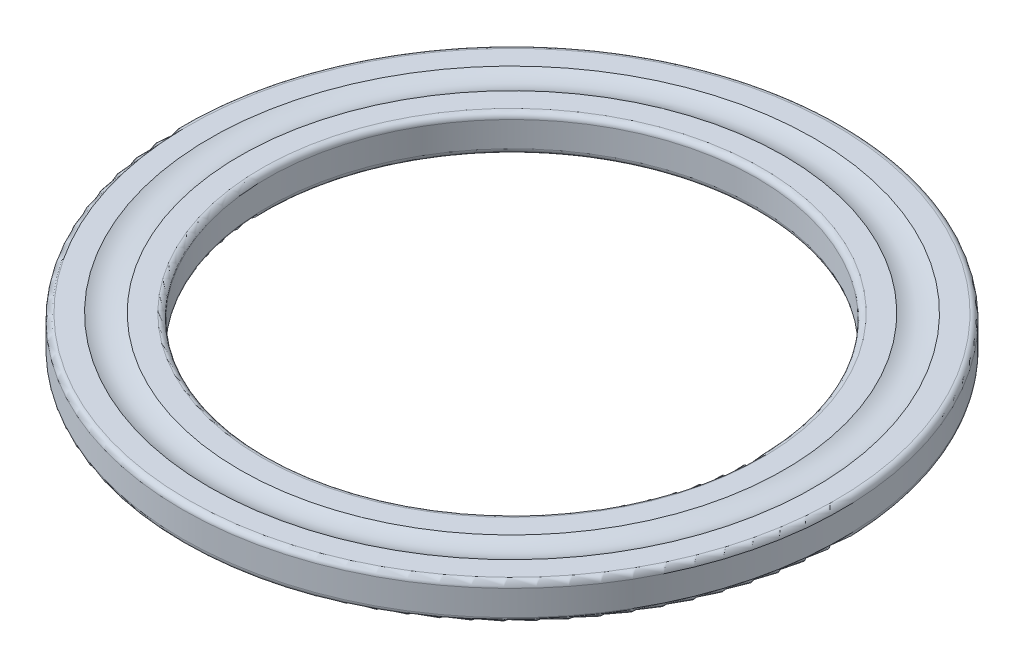
ISO-10303-21;
HEADER;
FILE_DESCRIPTION(('STEP AP214'),'2;1');
FILE_NAME('part.step','',(''),(''),'','','');
FILE_SCHEMA(('AUTOMOTIVE_DESIGN { 1 0 10303 214 1 1 1 1 }'));
ENDSEC;
DATA;
#1=APPLICATION_CONTEXT('core data for automotive mechanical design processes');
#2=APPLICATION_PROTOCOL_DEFINITION('international standard','automotive_design',2000,#1);
#3=PRODUCT_CONTEXT('',#1,'mechanical');
#4=PRODUCT('Part','Part','',(#3));
#5=PRODUCT_RELATED_PRODUCT_CATEGORY('part','',(#4));
#6=PRODUCT_DEFINITION_FORMATION('','',#4);
#7=PRODUCT_DEFINITION_CONTEXT('part definition',#1,'design');
#8=PRODUCT_DEFINITION('design','',#6,#7);
#9=PRODUCT_DEFINITION_SHAPE('','',#8);
#10=(LENGTH_UNIT() NAMED_UNIT(*) SI_UNIT(.MILLI.,.METRE.));
#11=(NAMED_UNIT(*) PLANE_ANGLE_UNIT() SI_UNIT($,.RADIAN.));
#12=(NAMED_UNIT(*) SI_UNIT($,.STERADIAN.) SOLID_ANGLE_UNIT());
#13=UNCERTAINTY_MEASURE_WITH_UNIT(LENGTH_MEASURE(1.E-05),#10,'distance_accuracy_value','');
#14=(GEOMETRIC_REPRESENTATION_CONTEXT(3) GLOBAL_UNCERTAINTY_ASSIGNED_CONTEXT((#13)) GLOBAL_UNIT_ASSIGNED_CONTEXT((#10,
#11,#12)) REPRESENTATION_CONTEXT('',''));
#15=CARTESIAN_POINT('',(0.,0.,0.));
#16=DIRECTION('',(0.,0.,1.));
#17=DIRECTION('',(1.,0.,0.));
#18=AXIS2_PLACEMENT_3D('',#15,#16,#17);
#19=CARTESIAN_POINT('',(-34.4,0.,0.));
#20=DIRECTION('',(0.,-1.,0.));
#21=DIRECTION('',(0.,0.,-1.));
#22=AXIS2_PLACEMENT_3D('',#19,#20,#21);
#23=PLANE('',#22);
#24=CARTESIAN_POINT('',(0.,0.,0.));
#25=DIRECTION('',(0.,1.,0.));
#26=DIRECTION('',(0.,0.,1.));
#27=AXIS2_PLACEMENT_3D('',#24,#25,#26);
#28=CIRCLE('',#27,26.6);
#29=CARTESIAN_POINT('',(0.,0.,26.6));
#30=VERTEX_POINT('',#29);
#31=EDGE_CURVE('E56',#30,#30,#28,.T.);
#32=ORIENTED_EDGE('',*,*,#31,.T.);
#33=EDGE_LOOP('',(#32));
#34=FACE_BOUND('',#33,.T.);
#35=CARTESIAN_POINT('',(0.,0.,0.));
#36=DIRECTION('',(0.,1.,0.));
#37=DIRECTION('',(0.,0.,1.));
#38=AXIS2_PLACEMENT_3D('',#35,#36,#37);
#39=CIRCLE('',#38,34.4);
#40=CARTESIAN_POINT('',(0.,0.,34.4));
#41=VERTEX_POINT('',#40);
#42=EDGE_CURVE('E54',#41,#41,#39,.T.);
#43=ORIENTED_EDGE('',*,*,#42,.F.);
#44=EDGE_LOOP('',(#43));
#45=FACE_BOUND('',#44,.T.);
#46=ADVANCED_FACE('F14',(#34,#45),#23,.T.);
#47=CARTESIAN_POINT('',(0.,0.599999999999872,0.));
#48=DIRECTION('',(0.,1.,0.));
#49=DIRECTION('',(0.,0.,1.));
#50=AXIS2_PLACEMENT_3D('',#47,#48,#49);
#51=TOROIDAL_SURFACE('',#50,26.6,0.599999999999872);
#52=CARTESIAN_POINT('',(0.,0.6,0.));
#53=DIRECTION('',(0.,1.,0.));
#54=DIRECTION('',(0.,0.,1.));
#55=AXIS2_PLACEMENT_3D('',#52,#53,#54);
#56=CIRCLE('',#55,26.);
#57=CARTESIAN_POINT('',(0.,0.6,26.));
#58=VERTEX_POINT('',#57);
#59=EDGE_CURVE('E51',#58,#58,#56,.T.);
#60=ORIENTED_EDGE('',*,*,#59,.T.);
#61=EDGE_LOOP('',(#60));
#62=FACE_BOUND('',#61,.T.);
#63=ORIENTED_EDGE('',*,*,#31,.F.);
#64=EDGE_LOOP('',(#63));
#65=FACE_BOUND('',#64,.T.);
#66=ADVANCED_FACE('F68',(#62,#65),#51,.T.);
#67=CARTESIAN_POINT('',(0.,3.8888888888889,0.));
#68=DIRECTION('',(0.,1.,0.));
#69=DIRECTION('',(0.,0.,1.));
#70=AXIS2_PLACEMENT_3D('',#67,#68,#69);
#71=CYLINDRICAL_SURFACE('',#70,26.);
#72=CARTESIAN_POINT('',(0.,3.2888888888889,0.));
#73=DIRECTION('',(0.,1.,0.));
#74=DIRECTION('',(0.,0.,1.));
#75=AXIS2_PLACEMENT_3D('',#72,#73,#74);
#76=CIRCLE('',#75,26.);
#77=CARTESIAN_POINT('',(0.,3.2888888888889,26.));
#78=VERTEX_POINT('',#77);
#79=EDGE_CURVE('E50',#78,#78,#76,.T.);
#80=ORIENTED_EDGE('',*,*,#79,.T.);
#81=EDGE_LOOP('',(#80));
#82=FACE_BOUND('',#81,.T.);
#83=ORIENTED_EDGE('',*,*,#59,.F.);
#84=EDGE_LOOP('',(#83));
#85=FACE_BOUND('',#84,.T.);
#86=ADVANCED_FACE('F67',(#82,#85),#71,.F.);
#87=CARTESIAN_POINT('',(0.,3.28888888888898,0.));
#88=DIRECTION('',(0.,1.,0.));
#89=DIRECTION('',(0.,0.,1.));
#90=AXIS2_PLACEMENT_3D('',#87,#88,#89);
#91=TOROIDAL_SURFACE('',#90,26.6,0.59999999999992);
#92=CARTESIAN_POINT('',(0.,3.8888888888889,0.));
#93=DIRECTION('',(0.,1.,0.));
#94=DIRECTION('',(0.,0.,1.));
#95=AXIS2_PLACEMENT_3D('',#92,#93,#94);
#96=CIRCLE('',#95,26.599999980008);
#97=CARTESIAN_POINT('',(0.,3.8888888888889,26.599999980008));
#98=VERTEX_POINT('',#97);
#99=EDGE_CURVE('E43',#98,#98,#96,.T.);
#100=ORIENTED_EDGE('',*,*,#99,.T.);
#101=EDGE_LOOP('',(#100));
#102=FACE_BOUND('',#101,.T.);
#103=ORIENTED_EDGE('',*,*,#79,.F.);
#104=EDGE_LOOP('',(#103));
#105=FACE_BOUND('',#104,.T.);
#106=ADVANCED_FACE('F76',(#102,#105),#91,.T.);
#107=CARTESIAN_POINT('',(-26.6,3.8888888888889,0.));
#108=DIRECTION('',(0.,1.,0.));
#109=DIRECTION('',(0.,0.,1.));
#110=AXIS2_PLACEMENT_3D('',#107,#108,#109);
#111=PLANE('',#110);
#112=CARTESIAN_POINT('',(0.,3.8888888888889,0.));
#113=DIRECTION('',(0.,1.,0.));
#114=DIRECTION('',(0.,0.,1.));
#115=AXIS2_PLACEMENT_3D('',#112,#113,#114);
#116=CIRCLE('',#115,28.896570034482);
#117=CARTESIAN_POINT('',(0.,3.8888888888889,28.896570034482));
#118=VERTEX_POINT('',#117);
#119=EDGE_CURVE('E39',#118,#118,#116,.T.);
#120=ORIENTED_EDGE('',*,*,#119,.T.);
#121=EDGE_LOOP('',(#120));
#122=FACE_BOUND('',#121,.T.);
#123=ORIENTED_EDGE('',*,*,#99,.F.);
#124=EDGE_LOOP('',(#123));
#125=FACE_BOUND('',#124,.T.);
#126=ADVANCED_FACE('F84',(#122,#125),#111,.T.);
#127=CARTESIAN_POINT('',(0.,7.,0.));
#128=DIRECTION('',(0.,1.,0.));
#129=DIRECTION('',(0.,0.,1.));
#130=AXIS2_PLACEMENT_3D('',#127,#128,#129);
#131=TOROIDAL_SURFACE('',#130,30.5,3.5);
#132=ORIENTED_EDGE('',*,*,#119,.F.);
#133=EDGE_LOOP('',(#132));
#134=FACE_BOUND('',#133,.T.);
#135=CARTESIAN_POINT('',(0.,3.8888888888889,0.));
#136=DIRECTION('',(0.,1.,0.));
#137=DIRECTION('',(0.,0.,1.));
#138=AXIS2_PLACEMENT_3D('',#135,#136,#137);
#139=CIRCLE('',#138,32.103429965518);
#140=CARTESIAN_POINT('',(0.,3.8888888888889,32.103429965518));
#141=VERTEX_POINT('',#140);
#142=EDGE_CURVE('E31',#141,#141,#139,.T.);
#143=ORIENTED_EDGE('',*,*,#142,.T.);
#144=EDGE_LOOP('',(#143));
#145=FACE_BOUND('',#144,.T.);
#146=ADVANCED_FACE('F87',(#134,#145),#131,.F.);
#147=CARTESIAN_POINT('',(-32.103429965518,3.8888888888889,0.));
#148=DIRECTION('',(0.,1.,0.));
#149=DIRECTION('',(0.,0.,1.));
#150=AXIS2_PLACEMENT_3D('',#147,#148,#149);
#151=PLANE('',#150);
#152=CARTESIAN_POINT('',(0.,3.8888888888889,0.));
#153=DIRECTION('',(0.,1.,0.));
#154=DIRECTION('',(0.,0.,1.));
#155=AXIS2_PLACEMENT_3D('',#152,#153,#154);
#156=CIRCLE('',#155,34.4);
#157=CARTESIAN_POINT('',(0.,3.8888888888889,34.4));
#158=VERTEX_POINT('',#157);
#159=EDGE_CURVE('E29',#158,#158,#156,.T.);
#160=ORIENTED_EDGE('',*,*,#159,.T.);
#161=EDGE_LOOP('',(#160));
#162=FACE_BOUND('',#161,.T.);
#163=ORIENTED_EDGE('',*,*,#142,.F.);
#164=EDGE_LOOP('',(#163));
#165=FACE_BOUND('',#164,.T.);
#166=ADVANCED_FACE('F93',(#162,#165),#151,.T.);
#167=CARTESIAN_POINT('',(0.,3.28888888888895,0.));
#168=DIRECTION('',(0.,1.,0.));
#169=DIRECTION('',(0.,0.,1.));
#170=AXIS2_PLACEMENT_3D('',#167,#168,#169);
#171=TOROIDAL_SURFACE('',#170,34.4,0.599999999999945);
#172=CARTESIAN_POINT('',(0.,3.2888888888889,0.));
#173=DIRECTION('',(0.,1.,0.));
#174=DIRECTION('',(0.,0.,1.));
#175=AXIS2_PLACEMENT_3D('',#172,#173,#174);
#176=CIRCLE('',#175,35.);
#177=CARTESIAN_POINT('',(0.,3.2888888888889,35.));
#178=VERTEX_POINT('',#177);
#179=EDGE_CURVE('E22',#178,#178,#176,.T.);
#180=ORIENTED_EDGE('',*,*,#179,.T.);
#181=EDGE_LOOP('',(#180));
#182=FACE_BOUND('',#181,.T.);
#183=ORIENTED_EDGE('',*,*,#159,.F.);
#184=EDGE_LOOP('',(#183));
#185=FACE_BOUND('',#184,.T.);
#186=ADVANCED_FACE('F92',(#182,#185),#171,.T.);
#187=CARTESIAN_POINT('',(0.,3.8888888888889,0.));
#188=DIRECTION('',(0.,1.,0.));
#189=DIRECTION('',(0.,0.,1.));
#190=AXIS2_PLACEMENT_3D('',#187,#188,#189);
#191=CYLINDRICAL_SURFACE('',#190,35.);
#192=CARTESIAN_POINT('',(0.,0.6,0.));
#193=DIRECTION('',(0.,1.,0.));
#194=DIRECTION('',(0.,0.,1.));
#195=AXIS2_PLACEMENT_3D('',#192,#193,#194);
#196=CIRCLE('',#195,35.);
#197=CARTESIAN_POINT('',(0.,0.6,35.));
#198=VERTEX_POINT('',#197);
#199=EDGE_CURVE('E9',#198,#198,#196,.T.);
#200=ORIENTED_EDGE('',*,*,#199,.T.);
#201=EDGE_LOOP('',(#200));
#202=FACE_BOUND('',#201,.T.);
#203=ORIENTED_EDGE('',*,*,#179,.F.);
#204=EDGE_LOOP('',(#203));
#205=FACE_BOUND('',#204,.T.);
#206=ADVANCED_FACE('F98',(#202,#205),#191,.T.);
#207=CARTESIAN_POINT('',(0.,0.599999999999892,0.));
#208=DIRECTION('',(0.,1.,0.));
#209=DIRECTION('',(0.,0.,1.));
#210=AXIS2_PLACEMENT_3D('',#207,#208,#209);
#211=TOROIDAL_SURFACE('',#210,34.4,0.599999999999892);
#212=ORIENTED_EDGE('',*,*,#42,.T.);
#213=EDGE_LOOP('',(#212));
#214=FACE_BOUND('',#213,.T.);
#215=ORIENTED_EDGE('',*,*,#199,.F.);
#216=EDGE_LOOP('',(#215));
#217=FACE_BOUND('',#216,.T.);
#218=ADVANCED_FACE('F16',(#214,#217),#211,.T.);
#219=CLOSED_SHELL('',(#46,#66,#86,#106,#126,#146,#166,#186,#206,#218));
#220=MANIFOLD_SOLID_BREP('B1',#219);
#221=ADVANCED_BREP_SHAPE_REPRESENTATION('',(#18,#220),#14);
#222=SHAPE_DEFINITION_REPRESENTATION(#9,#221);
ENDSEC;
END-ISO-10303-21;
